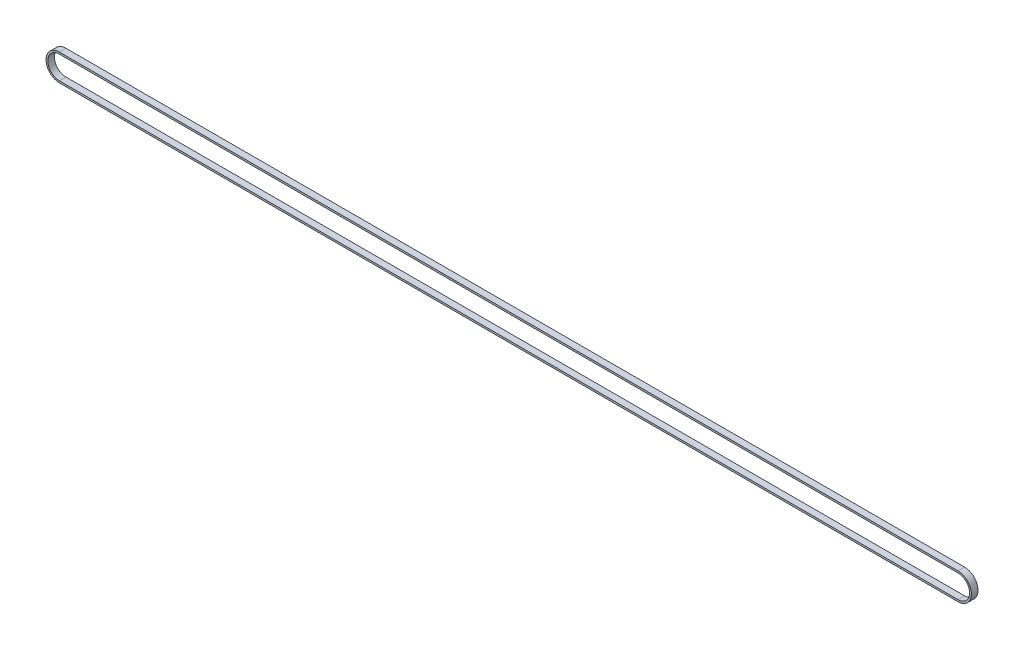
ISO-10303-21;
HEADER;
FILE_DESCRIPTION(('STEP AP214'),'2;1');
FILE_NAME('part.step','',(''),(''),'','','');
FILE_SCHEMA(('AUTOMOTIVE_DESIGN { 1 0 10303 214 1 1 1 1 }'));
ENDSEC;
DATA;
#1=APPLICATION_CONTEXT('core data for automotive mechanical design processes');
#2=APPLICATION_PROTOCOL_DEFINITION('international standard','automotive_design',2000,#1);
#3=PRODUCT_CONTEXT('',#1,'mechanical');
#4=PRODUCT('Part','Part','',(#3));
#5=PRODUCT_RELATED_PRODUCT_CATEGORY('part','',(#4));
#6=PRODUCT_DEFINITION_FORMATION('','',#4);
#7=PRODUCT_DEFINITION_CONTEXT('part definition',#1,'design');
#8=PRODUCT_DEFINITION('design','',#6,#7);
#9=PRODUCT_DEFINITION_SHAPE('','',#8);
#10=(LENGTH_UNIT() NAMED_UNIT(*) SI_UNIT(.MILLI.,.METRE.));
#11=(NAMED_UNIT(*) PLANE_ANGLE_UNIT() SI_UNIT($,.RADIAN.));
#12=(NAMED_UNIT(*) SI_UNIT($,.STERADIAN.) SOLID_ANGLE_UNIT());
#13=UNCERTAINTY_MEASURE_WITH_UNIT(LENGTH_MEASURE(1.E-05),#10,'distance_accuracy_value','');
#14=(GEOMETRIC_REPRESENTATION_CONTEXT(3) GLOBAL_UNCERTAINTY_ASSIGNED_CONTEXT((#13)) GLOBAL_UNIT_ASSIGNED_CONTEXT((#10,
#11,#12)) REPRESENTATION_CONTEXT('',''));
#15=CARTESIAN_POINT('',(0.,0.,0.));
#16=DIRECTION('',(0.,0.,1.));
#17=DIRECTION('',(1.,0.,0.));
#18=AXIS2_PLACEMENT_3D('',#15,#16,#17);
#19=CARTESIAN_POINT('',(1.7874590696465E-09,0.,2.49999999244653));
#20=DIRECTION('',(0.,0.,1.));
#21=DIRECTION('',(1.,0.,0.));
#22=AXIS2_PLACEMENT_3D('',#19,#20,#21);
#23=PLANE('',#22);
#24=CARTESIAN_POINT('',(1.7874590696465E-09,0.,2.49999999244653));
#25=DIRECTION('',(0.,0.,1.));
#26=DIRECTION('',(1.,0.,0.));
#27=AXIS2_PLACEMENT_3D('',#24,#25,#26);
#28=CIRCLE('',#27,10.13);
#29=CARTESIAN_POINT('',(1.7874590696465E-09,10.13,2.49999999244653));
#30=VERTEX_POINT('',#29);
#31=CARTESIAN_POINT('',(1.7874590696465E-09,-10.13,2.49999999244653));
#32=VERTEX_POINT('',#31);
#33=EDGE_CURVE('E168',#30,#32,#28,.T.);
#34=ORIENTED_EDGE('',*,*,#33,.T.);
#35=DIRECTION('',(1.,0.,0.));
#36=VECTOR('',#35,1.);
#37=CARTESIAN_POINT('',(682.000000001787,-10.13,2.49999999244653));
#38=LINE('',#37,#36);
#39=CARTESIAN_POINT('',(682.000000001787,-10.13,2.49999999244653));
#40=VERTEX_POINT('',#39);
#41=EDGE_CURVE('E171',#32,#40,#38,.T.);
#42=ORIENTED_EDGE('',*,*,#41,.T.);
#43=CARTESIAN_POINT('',(682.000000001787,0.,2.49999999244653));
#44=DIRECTION('',(0.,0.,1.));
#45=DIRECTION('',(1.,0.,0.));
#46=AXIS2_PLACEMENT_3D('',#43,#44,#45);
#47=CIRCLE('',#46,10.13);
#48=CARTESIAN_POINT('',(682.000000001787,10.13,2.49999999244653));
#49=VERTEX_POINT('',#48);
#50=EDGE_CURVE('E174',#40,#49,#47,.T.);
#51=ORIENTED_EDGE('',*,*,#50,.T.);
#52=DIRECTION('',(-1.,0.,0.));
#53=VECTOR('',#52,1.);
#54=CARTESIAN_POINT('',(1.7874590696465E-09,10.13,2.49999999244653));
#55=LINE('',#54,#53);
#56=EDGE_CURVE('E176',#49,#30,#55,.T.);
#57=ORIENTED_EDGE('',*,*,#56,.T.);
#58=EDGE_LOOP('',(#34,#42,#51,#57));
#59=FACE_BOUND('',#58,.T.);
#60=DIRECTION('',(1.,0.,0.));
#61=VECTOR('',#60,1.);
#62=CARTESIAN_POINT('',(682.000000001787,-8.74999999999998,2.49999999244653));
#63=LINE('',#62,#61);
#64=CARTESIAN_POINT('',(1.7874590696465E-09,-8.74999999999998,2.49999999244653));
#65=VERTEX_POINT('',#64);
#66=CARTESIAN_POINT('',(682.000000001787,-8.74999999999998,2.49999999244653));
#67=VERTEX_POINT('',#66);
#68=EDGE_CURVE('E140',#65,#67,#63,.T.);
#69=ORIENTED_EDGE('',*,*,#68,.F.);
#70=CARTESIAN_POINT('',(1.7874590696465E-09,0.,2.49999999244653));
#71=DIRECTION('',(0.,0.,1.));
#72=DIRECTION('',(1.,0.,0.));
#73=AXIS2_PLACEMENT_3D('',#70,#71,#72);
#74=CIRCLE('',#73,8.75);
#75=CARTESIAN_POINT('',(1.7874590696465E-09,8.74999999999998,2.49999999244653));
#76=VERTEX_POINT('',#75);
#77=EDGE_CURVE('E132',#76,#65,#74,.T.);
#78=ORIENTED_EDGE('',*,*,#77,.F.);
#79=DIRECTION('',(-1.,0.,0.));
#80=VECTOR('',#79,1.);
#81=CARTESIAN_POINT('',(1.7874590696465E-09,8.74999999999998,2.49999999244653));
#82=LINE('',#81,#80);
#83=CARTESIAN_POINT('',(682.000000001787,8.74999999999998,2.49999999244653));
#84=VERTEX_POINT('',#83);
#85=EDGE_CURVE('E154',#84,#76,#82,.T.);
#86=ORIENTED_EDGE('',*,*,#85,.F.);
#87=CARTESIAN_POINT('',(682.000000001787,0.,2.49999999244653));
#88=DIRECTION('',(0.,0.,1.));
#89=DIRECTION('',(1.,0.,0.));
#90=AXIS2_PLACEMENT_3D('',#87,#88,#89);
#91=CIRCLE('',#90,8.75);
#92=EDGE_CURVE('E152',#67,#84,#91,.T.);
#93=ORIENTED_EDGE('',*,*,#92,.F.);
#94=EDGE_LOOP('',(#69,#78,#86,#93));
#95=FACE_BOUND('',#94,.T.);
#96=ADVANCED_FACE('F67',(#59,#95),#23,.T.);
#97=CARTESIAN_POINT('',(1.7874590696465E-09,0.,-2.50000000755347));
#98=DIRECTION('',(0.,0.,1.));
#99=DIRECTION('',(1.,0.,0.));
#100=AXIS2_PLACEMENT_3D('',#97,#98,#99);
#101=PLANE('',#100);
#102=CARTESIAN_POINT('',(1.7874590696465E-09,0.,-2.50000000755347));
#103=DIRECTION('',(0.,0.,1.));
#104=DIRECTION('',(1.,0.,0.));
#105=AXIS2_PLACEMENT_3D('',#102,#103,#104);
#106=CIRCLE('',#105,10.13);
#107=CARTESIAN_POINT('',(1.7874590696465E-09,10.13,-2.50000000755347));
#108=VERTEX_POINT('',#107);
#109=CARTESIAN_POINT('',(1.7874590696465E-09,-10.13,-2.50000000755347));
#110=VERTEX_POINT('',#109);
#111=EDGE_CURVE('E148',#108,#110,#106,.T.);
#112=ORIENTED_EDGE('',*,*,#111,.F.);
#113=DIRECTION('',(-1.,0.,0.));
#114=VECTOR('',#113,1.);
#115=CARTESIAN_POINT('',(1.7874590696465E-09,10.13,-2.50000000755347));
#116=LINE('',#115,#114);
#117=CARTESIAN_POINT('',(682.000000001787,10.13,-2.50000000755347));
#118=VERTEX_POINT('',#117);
#119=EDGE_CURVE('E172',#118,#108,#116,.T.);
#120=ORIENTED_EDGE('',*,*,#119,.F.);
#121=CARTESIAN_POINT('',(682.000000001787,0.,-2.50000000755347));
#122=DIRECTION('',(0.,0.,1.));
#123=DIRECTION('',(1.,0.,0.));
#124=AXIS2_PLACEMENT_3D('',#121,#122,#123);
#125=CIRCLE('',#124,10.13);
#126=CARTESIAN_POINT('',(682.000000001787,-10.13,-2.50000000755347));
#127=VERTEX_POINT('',#126);
#128=EDGE_CURVE('E183',#127,#118,#125,.T.);
#129=ORIENTED_EDGE('',*,*,#128,.F.);
#130=DIRECTION('',(1.,0.,0.));
#131=VECTOR('',#130,1.);
#132=CARTESIAN_POINT('',(682.000000001787,-10.13,-2.50000000755347));
#133=LINE('',#132,#131);
#134=EDGE_CURVE('E181',#110,#127,#133,.T.);
#135=ORIENTED_EDGE('',*,*,#134,.F.);
#136=EDGE_LOOP('',(#112,#120,#129,#135));
#137=FACE_BOUND('',#136,.T.);
#138=CARTESIAN_POINT('',(1.7874590696465E-09,0.,-2.50000000755347));
#139=DIRECTION('',(0.,0.,1.));
#140=DIRECTION('',(1.,0.,0.));
#141=AXIS2_PLACEMENT_3D('',#138,#139,#140);
#142=CIRCLE('',#141,8.75);
#143=CARTESIAN_POINT('',(1.7874590696465E-09,8.74999999999998,-2.50000000755347));
#144=VERTEX_POINT('',#143);
#145=CARTESIAN_POINT('',(1.7874590696465E-09,-8.74999999999998,-2.50000000755347));
#146=VERTEX_POINT('',#145);
#147=EDGE_CURVE('E90',#144,#146,#142,.T.);
#148=ORIENTED_EDGE('',*,*,#147,.T.);
#149=DIRECTION('',(1.,0.,0.));
#150=VECTOR('',#149,1.);
#151=CARTESIAN_POINT('',(682.000000001787,-8.74999999999998,-2.50000000755347));
#152=LINE('',#151,#150);
#153=CARTESIAN_POINT('',(682.000000001787,-8.74999999999998,-2.50000000755347));
#154=VERTEX_POINT('',#153);
#155=EDGE_CURVE('E147',#146,#154,#152,.T.);
#156=ORIENTED_EDGE('',*,*,#155,.T.);
#157=CARTESIAN_POINT('',(682.000000001787,0.,-2.50000000755347));
#158=DIRECTION('',(0.,0.,1.));
#159=DIRECTION('',(1.,0.,0.));
#160=AXIS2_PLACEMENT_3D('',#157,#158,#159);
#161=CIRCLE('',#160,8.75);
#162=CARTESIAN_POINT('',(682.000000001787,8.74999999999998,-2.50000000755347));
#163=VERTEX_POINT('',#162);
#164=EDGE_CURVE('E160',#154,#163,#161,.T.);
#165=ORIENTED_EDGE('',*,*,#164,.T.);
#166=DIRECTION('',(-1.,0.,0.));
#167=VECTOR('',#166,1.);
#168=CARTESIAN_POINT('',(1.7874590696465E-09,8.74999999999998,-2.50000000755347));
#169=LINE('',#168,#167);
#170=EDGE_CURVE('E141',#163,#144,#169,.T.);
#171=ORIENTED_EDGE('',*,*,#170,.T.);
#172=EDGE_LOOP('',(#148,#156,#165,#171));
#173=FACE_BOUND('',#172,.T.);
#174=ADVANCED_FACE('F201',(#137,#173),#101,.F.);
#175=CARTESIAN_POINT('',(1.7874590696465E-09,0.,2.49999999244653));
#176=DIRECTION('',(0.,0.,-1.));
#177=DIRECTION('',(-1.,0.,0.));
#178=AXIS2_PLACEMENT_3D('',#175,#176,#177);
#179=CYLINDRICAL_SURFACE('',#178,10.13);
#180=ORIENTED_EDGE('',*,*,#111,.T.);
#181=DIRECTION('',(0.,0.,-1.));
#182=VECTOR('',#181,1.);
#183=CARTESIAN_POINT('',(1.7874590696465E-09,-10.13,2.49999999244653));
#184=LINE('',#183,#182);
#185=EDGE_CURVE('E14',#32,#110,#184,.T.);
#186=ORIENTED_EDGE('',*,*,#185,.F.);
#187=ORIENTED_EDGE('',*,*,#33,.F.);
#188=DIRECTION('',(0.,0.,-1.));
#189=VECTOR('',#188,1.);
#190=CARTESIAN_POINT('',(1.7874590696465E-09,10.13,2.49999999244653));
#191=LINE('',#190,#189);
#192=EDGE_CURVE('E178',#30,#108,#191,.T.);
#193=ORIENTED_EDGE('',*,*,#192,.T.);
#194=EDGE_LOOP('',(#180,#186,#187,#193));
#195=FACE_BOUND('',#194,.T.);
#196=ADVANCED_FACE('F69',(#195),#179,.T.);
#197=CARTESIAN_POINT('',(682.000000001787,-10.13,2.49999999244653));
#198=DIRECTION('',(0.,1.,0.));
#199=DIRECTION('',(0.,0.,1.));
#200=AXIS2_PLACEMENT_3D('',#197,#198,#199);
#201=PLANE('',#200);
#202=ORIENTED_EDGE('',*,*,#134,.T.);
#203=DIRECTION('',(0.,0.,-1.));
#204=VECTOR('',#203,1.);
#205=CARTESIAN_POINT('',(682.000000001787,-10.13,2.49999999244653));
#206=LINE('',#205,#204);
#207=EDGE_CURVE('E75',#40,#127,#206,.T.);
#208=ORIENTED_EDGE('',*,*,#207,.F.);
#209=ORIENTED_EDGE('',*,*,#41,.F.);
#210=ORIENTED_EDGE('',*,*,#185,.T.);
#211=EDGE_LOOP('',(#202,#208,#209,#210));
#212=FACE_BOUND('',#211,.T.);
#213=ADVANCED_FACE('F211',(#212),#201,.F.);
#214=CARTESIAN_POINT('',(682.000000001787,0.,2.49999999244653));
#215=DIRECTION('',(0.,0.,-1.));
#216=DIRECTION('',(-1.,0.,0.));
#217=AXIS2_PLACEMENT_3D('',#214,#215,#216);
#218=CYLINDRICAL_SURFACE('',#217,10.13);
#219=ORIENTED_EDGE('',*,*,#128,.T.);
#220=DIRECTION('',(0.,0.,-1.));
#221=VECTOR('',#220,1.);
#222=CARTESIAN_POINT('',(682.000000001787,10.13,2.49999999244653));
#223=LINE('',#222,#221);
#224=EDGE_CURVE('E188',#49,#118,#223,.T.);
#225=ORIENTED_EDGE('',*,*,#224,.F.);
#226=ORIENTED_EDGE('',*,*,#50,.F.);
#227=ORIENTED_EDGE('',*,*,#207,.T.);
#228=EDGE_LOOP('',(#219,#225,#226,#227));
#229=FACE_BOUND('',#228,.T.);
#230=ADVANCED_FACE('F195',(#229),#218,.T.);
#231=CARTESIAN_POINT('',(1.7874590696465E-09,10.13,2.49999999244653));
#232=DIRECTION('',(0.,-1.,0.));
#233=DIRECTION('',(0.,0.,-1.));
#234=AXIS2_PLACEMENT_3D('',#231,#232,#233);
#235=PLANE('',#234);
#236=ORIENTED_EDGE('',*,*,#119,.T.);
#237=ORIENTED_EDGE('',*,*,#192,.F.);
#238=ORIENTED_EDGE('',*,*,#56,.F.);
#239=ORIENTED_EDGE('',*,*,#224,.T.);
#240=EDGE_LOOP('',(#236,#237,#238,#239));
#241=FACE_BOUND('',#240,.T.);
#242=ADVANCED_FACE('F205',(#241),#235,.F.);
#243=CARTESIAN_POINT('',(1.7874590696465E-09,0.,2.49999999244653));
#244=DIRECTION('',(0.,0.,-1.));
#245=DIRECTION('',(-1.,0.,0.));
#246=AXIS2_PLACEMENT_3D('',#243,#244,#245);
#247=CYLINDRICAL_SURFACE('',#246,8.75);
#248=ORIENTED_EDGE('',*,*,#147,.F.);
#249=DIRECTION('',(0.,0.,-1.));
#250=VECTOR('',#249,1.);
#251=CARTESIAN_POINT('',(1.7874590696465E-09,8.74999999999998,2.49999999244653));
#252=LINE('',#251,#250);
#253=EDGE_CURVE('E136',#76,#144,#252,.T.);
#254=ORIENTED_EDGE('',*,*,#253,.F.);
#255=ORIENTED_EDGE('',*,*,#77,.T.);
#256=DIRECTION('',(0.,0.,-1.));
#257=VECTOR('',#256,1.);
#258=CARTESIAN_POINT('',(1.7874590696465E-09,-8.74999999999998,2.49999999244653));
#259=LINE('',#258,#257);
#260=EDGE_CURVE('E135',#65,#146,#259,.T.);
#261=ORIENTED_EDGE('',*,*,#260,.T.);
#262=EDGE_LOOP('',(#248,#254,#255,#261));
#263=FACE_BOUND('',#262,.T.);
#264=ADVANCED_FACE('F134',(#263),#247,.F.);
#265=CARTESIAN_POINT('',(682.000000001787,-8.74999999999998,2.49999999244653));
#266=DIRECTION('',(0.,1.,0.));
#267=DIRECTION('',(0.,0.,1.));
#268=AXIS2_PLACEMENT_3D('',#265,#266,#267);
#269=PLANE('',#268);
#270=ORIENTED_EDGE('',*,*,#155,.F.);
#271=ORIENTED_EDGE('',*,*,#260,.F.);
#272=ORIENTED_EDGE('',*,*,#68,.T.);
#273=DIRECTION('',(0.,0.,-1.));
#274=VECTOR('',#273,1.);
#275=CARTESIAN_POINT('',(682.000000001787,-8.74999999999998,2.49999999244653));
#276=LINE('',#275,#274);
#277=EDGE_CURVE('E149',#67,#154,#276,.T.);
#278=ORIENTED_EDGE('',*,*,#277,.T.);
#279=EDGE_LOOP('',(#270,#271,#272,#278));
#280=FACE_BOUND('',#279,.T.);
#281=ADVANCED_FACE('F144',(#280),#269,.T.);
#282=CARTESIAN_POINT('',(682.000000001787,0.,2.49999999244653));
#283=DIRECTION('',(0.,0.,-1.));
#284=DIRECTION('',(-1.,0.,0.));
#285=AXIS2_PLACEMENT_3D('',#282,#283,#284);
#286=CYLINDRICAL_SURFACE('',#285,8.75);
#287=ORIENTED_EDGE('',*,*,#164,.F.);
#288=ORIENTED_EDGE('',*,*,#277,.F.);
#289=ORIENTED_EDGE('',*,*,#92,.T.);
#290=DIRECTION('',(0.,0.,-1.));
#291=VECTOR('',#290,1.);
#292=CARTESIAN_POINT('',(682.000000001787,8.74999999999998,2.49999999244653));
#293=LINE('',#292,#291);
#294=EDGE_CURVE('E82',#84,#163,#293,.T.);
#295=ORIENTED_EDGE('',*,*,#294,.T.);
#296=EDGE_LOOP('',(#287,#288,#289,#295));
#297=FACE_BOUND('',#296,.T.);
#298=ADVANCED_FACE('F234',(#297),#286,.F.);
#299=CARTESIAN_POINT('',(1.7874590696465E-09,8.74999999999998,2.49999999244653));
#300=DIRECTION('',(0.,-1.,0.));
#301=DIRECTION('',(0.,0.,-1.));
#302=AXIS2_PLACEMENT_3D('',#299,#300,#301);
#303=PLANE('',#302);
#304=ORIENTED_EDGE('',*,*,#170,.F.);
#305=ORIENTED_EDGE('',*,*,#294,.F.);
#306=ORIENTED_EDGE('',*,*,#85,.T.);
#307=ORIENTED_EDGE('',*,*,#253,.T.);
#308=EDGE_LOOP('',(#304,#305,#306,#307));
#309=FACE_BOUND('',#308,.T.);
#310=ADVANCED_FACE('F238',(#309),#303,.T.);
#311=CLOSED_SHELL('',(#96,#174,#196,#213,#230,#242,#264,#281,#298,#310));
#312=MANIFOLD_SOLID_BREP('B2',#311);
#313=ADVANCED_BREP_SHAPE_REPRESENTATION('',(#18,#312),#14);
#314=SHAPE_DEFINITION_REPRESENTATION(#9,#313);
ENDSEC;
END-ISO-10303-21;
